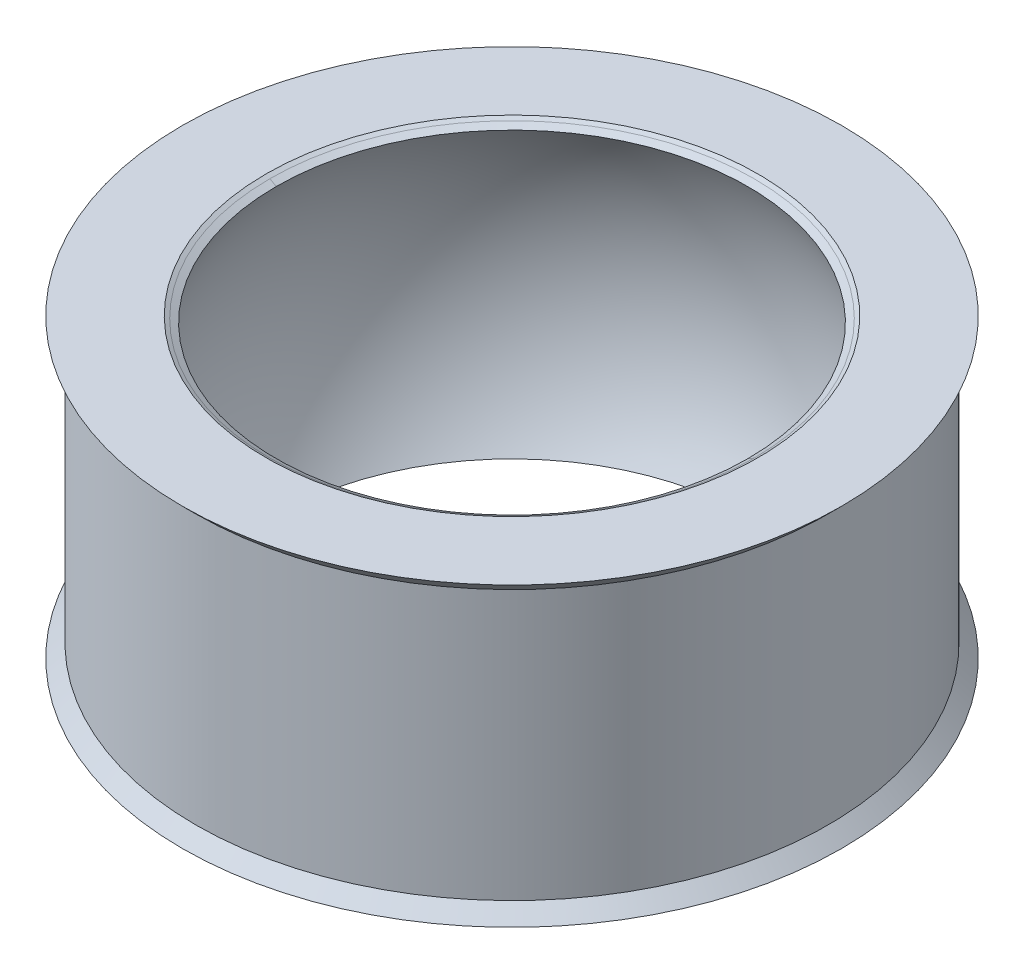
ISO-10303-21;
HEADER;
FILE_DESCRIPTION(('STEP AP214'),'2;1');
FILE_NAME('part.step','',(''),(''),'','','');
FILE_SCHEMA(('AUTOMOTIVE_DESIGN { 1 0 10303 214 1 1 1 1 }'));
ENDSEC;
DATA;
#1=APPLICATION_CONTEXT('core data for automotive mechanical design processes');
#2=APPLICATION_PROTOCOL_DEFINITION('international standard','automotive_design',2000,#1);
#3=PRODUCT_CONTEXT('',#1,'mechanical');
#4=PRODUCT('Part','Part','',(#3));
#5=PRODUCT_RELATED_PRODUCT_CATEGORY('part','',(#4));
#6=PRODUCT_DEFINITION_FORMATION('','',#4);
#7=PRODUCT_DEFINITION_CONTEXT('part definition',#1,'design');
#8=PRODUCT_DEFINITION('design','',#6,#7);
#9=PRODUCT_DEFINITION_SHAPE('','',#8);
#10=(LENGTH_UNIT() NAMED_UNIT(*) SI_UNIT(.MILLI.,.METRE.));
#11=(NAMED_UNIT(*) PLANE_ANGLE_UNIT() SI_UNIT($,.RADIAN.));
#12=(NAMED_UNIT(*) SI_UNIT($,.STERADIAN.) SOLID_ANGLE_UNIT());
#13=UNCERTAINTY_MEASURE_WITH_UNIT(LENGTH_MEASURE(1.E-05),#10,'distance_accuracy_value','');
#14=(GEOMETRIC_REPRESENTATION_CONTEXT(3) GLOBAL_UNCERTAINTY_ASSIGNED_CONTEXT((#13)) GLOBAL_UNIT_ASSIGNED_CONTEXT((#10,
#11,#12)) REPRESENTATION_CONTEXT('',''));
#15=CARTESIAN_POINT('',(0.,0.,0.));
#16=DIRECTION('',(0.,0.,1.));
#17=DIRECTION('',(1.,0.,0.));
#18=AXIS2_PLACEMENT_3D('',#15,#16,#17);
#19=CARTESIAN_POINT('',(0.00761999999999634,0.,61.9252));
#20=DIRECTION('',(0.,0.,-1.));
#21=DIRECTION('',(1.,0.,0.));
#22=AXIS2_PLACEMENT_3D('',#19,#20,#21);
#23=CIRCLE('',#22,10.3059784389139);
#24=TRIMMED_CURVE('',#23,(PARAMETER_VALUE(-1.57153570353039)),
(PARAMETER_VALUE(1.57153570353039)),.T.,.PARAMETER.);
#25=CARTESIAN_POINT('',(0.,0.,61.9252));
#26=DIRECTION('',(0.,-1.,0.));
#27=AXIS1_PLACEMENT('',#25,#26);
#28=SURFACE_OF_REVOLUTION('',#24,#27);
#29=CARTESIAN_POINT('',(0.,5.33089375278451,61.9252));
#30=DIRECTION('',(0.,1.,0.));
#31=DIRECTION('',(1.,0.,0.));
#32=AXIS2_PLACEMENT_3D('',#29,#30,#31);
#33=CIRCLE('',#32,8.82775397747082);
#34=CARTESIAN_POINT('',(8.82775397743589,5.33089375276572,61.9252));
#35=VERTEX_POINT('',#34);
#36=CARTESIAN_POINT('',(-8.82775397740902,5.33089375273474,61.9252));
#37=VERTEX_POINT('',#36);
#38=EDGE_CURVE('E65',#35,#37,#33,.T.);
#39=ORIENTED_EDGE('',*,*,#38,.T.);
#40=CARTESIAN_POINT('',(0.,5.33089375278451,61.9252));
#41=DIRECTION('',(0.,1.,0.));
#42=DIRECTION('',(1.,0.,0.));
#43=AXIS2_PLACEMENT_3D('',#40,#41,#42);
#44=CIRCLE('',#43,8.82775397747082);
#45=EDGE_CURVE('E63',#37,#35,#44,.T.);
#46=ORIENTED_EDGE('',*,*,#45,.T.);
#47=EDGE_LOOP('',(#39,#46));
#48=FACE_BOUND('',#47,.T.);
#49=CARTESIAN_POINT('',(0.,-5.3308937527845,61.9252));
#50=DIRECTION('',(0.,-1.,0.));
#51=DIRECTION('',(1.,0.,0.));
#52=AXIS2_PLACEMENT_3D('',#49,#50,#51);
#53=CIRCLE('',#52,8.82775397747082);
#54=CARTESIAN_POINT('',(8.82775397747082,-5.3308937527845,61.9252));
#55=VERTEX_POINT('',#54);
#56=EDGE_CURVE('E71',#55,#55,#53,.T.);
#57=ORIENTED_EDGE('',*,*,#56,.T.);
#58=EDGE_LOOP('',(#57));
#59=FACE_BOUND('',#58,.T.);
#60=ADVANCED_FACE('F15',(#48,#59),#28,.F.);
#61=CARTESIAN_POINT('',(0.,-5.46676973482363,61.9252));
#62=DIRECTION('',(0.,-1.,0.));
#63=DIRECTION('',(1.,0.,0.));
#64=AXIS2_PLACEMENT_3D('',#61,#62,#63);
#65=CONICAL_SURFACE('',#64,9.06319296990432,1.04737208404039);
#66=CARTESIAN_POINT('',(0.,-5.46676973488924,61.9252));
#67=DIRECTION('',(0.,-1.,0.));
#68=DIRECTION('',(0.,0.,1.));
#69=AXIS2_PLACEMENT_3D('',#66,#67,#68);
#70=CIRCLE('',#69,9.06319297001801);
#71=CARTESIAN_POINT('',(0.,-5.4667573076736,70.9884004721651));
#72=VERTEX_POINT('',#71);
#73=CARTESIAN_POINT('',(-9.06320047214609,-5.46675730766267,61.9252));
#74=VERTEX_POINT('',#73);
#75=EDGE_CURVE('E82',#72,#74,#70,.T.);
#76=ORIENTED_EDGE('',*,*,#75,.T.);
#77=CARTESIAN_POINT('',(0.,-5.46676973488924,61.9252));
#78=DIRECTION('',(0.,-1.,0.));
#79=DIRECTION('',(-1.,0.,0.));
#80=AXIS2_PLACEMENT_3D('',#77,#78,#79);
#81=CIRCLE('',#80,9.06319297001801);
#82=CARTESIAN_POINT('',(0.,-5.4667573076736,52.861999527835));
#83=VERTEX_POINT('',#82);
#84=EDGE_CURVE('E221',#74,#83,#81,.T.);
#85=ORIENTED_EDGE('',*,*,#84,.T.);
#86=CARTESIAN_POINT('',(0.,-5.46676973488924,61.9252));
#87=DIRECTION('',(0.,-1.,0.));
#88=DIRECTION('',(0.,0.,-1.));
#89=AXIS2_PLACEMENT_3D('',#86,#87,#88);
#90=CIRCLE('',#89,9.06319297001801);
#91=CARTESIAN_POINT('',(9.06320047214609,-5.46675730766267,61.9252));
#92=VERTEX_POINT('',#91);
#93=EDGE_CURVE('E218',#83,#92,#90,.T.);
#94=ORIENTED_EDGE('',*,*,#93,.T.);
#95=CARTESIAN_POINT('',(0.,-5.46676973488924,61.9252));
#96=DIRECTION('',(0.,-1.,0.));
#97=DIRECTION('',(1.,0.,0.));
#98=AXIS2_PLACEMENT_3D('',#95,#96,#97);
#99=CIRCLE('',#98,9.06319297001801);
#100=EDGE_CURVE('E176',#92,#72,#99,.T.);
#101=ORIENTED_EDGE('',*,*,#100,.T.);
#102=EDGE_LOOP('',(#76,#85,#94,#101));
#103=FACE_BOUND('',#102,.T.);
#104=ORIENTED_EDGE('',*,*,#56,.F.);
#105=EDGE_LOOP('',(#104));
#106=FACE_BOUND('',#105,.T.);
#107=ADVANCED_FACE('F191',(#103,#106),#65,.F.);
#108=CARTESIAN_POINT('',(0.,5.46676973482363,61.9252));
#109=DIRECTION('',(0.,1.,0.));
#110=DIRECTION('',(0.,0.,1.));
#111=AXIS2_PLACEMENT_3D('',#108,#109,#110);
#112=CONICAL_SURFACE('',#111,9.06319296984748,1.04737208404039);
#113=CARTESIAN_POINT('',(0.,5.46676973488924,61.9252));
#114=DIRECTION('',(0.,1.,0.));
#115=DIRECTION('',(1.,0.,0.));
#116=AXIS2_PLACEMENT_3D('',#113,#114,#115);
#117=CIRCLE('',#116,9.06319296996116);
#118=CARTESIAN_POINT('',(9.0632004721082,5.46675730764919,61.9252));
#119=VERTEX_POINT('',#118);
#120=CARTESIAN_POINT('',(0.,5.46675730769001,52.861999527835));
#121=VERTEX_POINT('',#120);
#122=EDGE_CURVE('E106',#119,#121,#117,.T.);
#123=ORIENTED_EDGE('',*,*,#122,.T.);
#124=CARTESIAN_POINT('',(0.,5.46676973495485,61.9252));
#125=DIRECTION('',(0.,1.,0.));
#126=DIRECTION('',(0.,0.,-1.));
#127=AXIS2_PLACEMENT_3D('',#124,#125,#126);
#128=CIRCLE('',#127,9.06319297007485);
#129=CARTESIAN_POINT('',(-9.06320047212714,5.46675730765065,61.9252));
#130=VERTEX_POINT('',#129);
#131=EDGE_CURVE('E76',#121,#130,#128,.T.);
#132=ORIENTED_EDGE('',*,*,#131,.T.);
#133=DIRECTION('',(0.866112657056274,-0.499848842438313,0.));
#134=VECTOR('',#133,1.);
#135=CARTESIAN_POINT('',(-499000.,287981.909693369,61.9252000007968));
#136=LINE('',#135,#134);
#137=EDGE_CURVE('E70',#130,#37,#136,.T.);
#138=ORIENTED_EDGE('',*,*,#137,.T.);
#139=ORIENTED_EDGE('',*,*,#38,.F.);
#140=DIRECTION('',(-0.866112657056274,-0.499848842438312,0.));
#141=VECTOR('',#140,1.);
#142=CARTESIAN_POINT('',(499000.,287981.909693369,61.9251999992479));
#143=LINE('',#142,#141);
#144=EDGE_CURVE('E80',#35,#119,#143,.F.);
#145=ORIENTED_EDGE('',*,*,#144,.T.);
#146=EDGE_LOOP('',(#123,#132,#138,#139,#145));
#147=FACE_BOUND('',#146,.T.);
#148=ADVANCED_FACE('F74',(#147),#112,.F.);
#149=CARTESIAN_POINT('',(0.,5.46676973476679,61.9252));
#150=DIRECTION('',(0.,1.,0.));
#151=DIRECTION('',(0.,0.,1.));
#152=AXIS2_PLACEMENT_3D('',#149,#150,#151);
#153=CONICAL_SURFACE('',#152,9.06319296979063,1.04737208411698);
#154=ORIENTED_EDGE('',*,*,#45,.F.);
#155=ORIENTED_EDGE('',*,*,#137,.F.);
#156=CARTESIAN_POINT('',(0.,5.4667697348652,61.9252));
#157=DIRECTION('',(0.,1.,0.));
#158=DIRECTION('',(-1.,0.,0.));
#159=AXIS2_PLACEMENT_3D('',#156,#157,#158);
#160=CIRCLE('',#159,9.06319296996117);
#161=CARTESIAN_POINT('',(0.,5.46675730766159,70.9884004721366));
#162=VERTEX_POINT('',#161);
#163=EDGE_CURVE('E36',#130,#162,#160,.T.);
#164=ORIENTED_EDGE('',*,*,#163,.T.);
#165=CARTESIAN_POINT('',(0.,5.4667697348652,61.9252));
#166=DIRECTION('',(0.,1.,0.));
#167=DIRECTION('',(0.,0.,1.));
#168=AXIS2_PLACEMENT_3D('',#165,#166,#167);
#169=CIRCLE('',#168,9.06319296996116);
#170=EDGE_CURVE('E222',#162,#119,#169,.T.);
#171=ORIENTED_EDGE('',*,*,#170,.T.);
#172=ORIENTED_EDGE('',*,*,#144,.F.);
#173=EDGE_LOOP('',(#154,#155,#164,#171,#172));
#174=FACE_BOUND('',#173,.T.);
#175=ADVANCED_FACE('F79',(#174),#153,.F.);
#176=CARTESIAN_POINT('',(0.,-5.5499,61.9252));
#177=DIRECTION('',(0.,-1.,0.));
#178=DIRECTION('',(1.,0.,0.));
#179=AXIS2_PLACEMENT_3D('',#176,#177,#178);
#180=CONICAL_SURFACE('',#179,9.20723686626833,1.0471975511966);
#181=CARTESIAN_POINT('',(0.,-5.5499,61.9252));
#182=DIRECTION('',(0.,-1.,0.));
#183=DIRECTION('',(1.,0.,0.));
#184=AXIS2_PLACEMENT_3D('',#181,#182,#183);
#185=CIRCLE('',#184,9.20723686626833);
#186=CARTESIAN_POINT('',(9.20723686626833,-5.5499,61.9252));
#187=VERTEX_POINT('',#186);
#188=EDGE_CURVE('E100',#187,#187,#185,.F.);
#189=ORIENTED_EDGE('',*,*,#188,.F.);
#190=EDGE_LOOP('',(#189));
#191=FACE_BOUND('',#190,.T.);
#192=ORIENTED_EDGE('',*,*,#75,.F.);
#193=ORIENTED_EDGE('',*,*,#100,.F.);
#194=ORIENTED_EDGE('',*,*,#93,.F.);
#195=ORIENTED_EDGE('',*,*,#84,.F.);
#196=EDGE_LOOP('',(#192,#193,#194,#195));
#197=FACE_BOUND('',#196,.T.);
#198=ADVANCED_FACE('F123',(#191,#197),#180,.F.);
#199=CARTESIAN_POINT('',(0.,5.5499,61.9252));
#200=DIRECTION('',(0.,1.,0.));
#201=DIRECTION('',(-1.,0.,0.));
#202=AXIS2_PLACEMENT_3D('',#199,#200,#201);
#203=CONICAL_SURFACE('',#202,9.20723686626833,1.04719755119659);
#204=CARTESIAN_POINT('',(0.,5.5499,61.9252));
#205=DIRECTION('',(0.,1.,0.));
#206=DIRECTION('',(-1.,0.,0.));
#207=AXIS2_PLACEMENT_3D('',#204,#205,#206);
#208=CIRCLE('',#207,9.20723686626833);
#209=CARTESIAN_POINT('',(-9.20723686626833,5.5499,61.9252));
#210=VERTEX_POINT('',#209);
#211=EDGE_CURVE('E97',#210,#210,#208,.F.);
#212=ORIENTED_EDGE('',*,*,#211,.F.);
#213=EDGE_LOOP('',(#212));
#214=FACE_BOUND('',#213,.T.);
#215=ORIENTED_EDGE('',*,*,#170,.F.);
#216=ORIENTED_EDGE('',*,*,#163,.F.);
#217=ORIENTED_EDGE('',*,*,#131,.F.);
#218=ORIENTED_EDGE('',*,*,#122,.F.);
#219=EDGE_LOOP('',(#215,#216,#217,#218));
#220=FACE_BOUND('',#219,.T.);
#221=ADVANCED_FACE('F112',(#214,#220),#203,.F.);
#222=CARTESIAN_POINT('',(0.,-5.5499,61.9252));
#223=DIRECTION('',(0.,-1.,0.));
#224=DIRECTION('',(0.,0.,-1.));
#225=AXIS2_PLACEMENT_3D('',#222,#223,#224);
#226=PLANE('',#225);
#227=ORIENTED_EDGE('',*,*,#188,.T.);
#228=EDGE_LOOP('',(#227));
#229=FACE_BOUND('',#228,.T.);
#230=CARTESIAN_POINT('',(0.,-5.5499,61.9252));
#231=DIRECTION('',(0.,-1.,0.));
#232=DIRECTION('',(0.,0.,-1.));
#233=AXIS2_PLACEMENT_3D('',#230,#231,#232);
#234=CIRCLE('',#233,12.3444);
#235=CARTESIAN_POINT('',(0.,-5.5499,49.5808));
#236=VERTEX_POINT('',#235);
#237=EDGE_CURVE('E94',#236,#236,#234,.F.);
#238=ORIENTED_EDGE('',*,*,#237,.F.);
#239=EDGE_LOOP('',(#238));
#240=FACE_BOUND('',#239,.T.);
#241=ADVANCED_FACE('F122',(#229,#240),#226,.T.);
#242=CARTESIAN_POINT('',(0.,5.5499,61.9252));
#243=DIRECTION('',(0.,1.,0.));
#244=DIRECTION('',(0.,0.,1.));
#245=AXIS2_PLACEMENT_3D('',#242,#243,#244);
#246=PLANE('',#245);
#247=ORIENTED_EDGE('',*,*,#211,.T.);
#248=EDGE_LOOP('',(#247));
#249=FACE_BOUND('',#248,.T.);
#250=CARTESIAN_POINT('',(0.,5.5499,61.9252));
#251=DIRECTION('',(0.,1.,0.));
#252=DIRECTION('',(0.,0.,1.));
#253=AXIS2_PLACEMENT_3D('',#250,#251,#252);
#254=CIRCLE('',#253,12.3444);
#255=CARTESIAN_POINT('',(0.,5.5499,74.2696));
#256=VERTEX_POINT('',#255);
#257=EDGE_CURVE('E91',#256,#256,#254,.F.);
#258=ORIENTED_EDGE('',*,*,#257,.F.);
#259=EDGE_LOOP('',(#258));
#260=FACE_BOUND('',#259,.T.);
#261=ADVANCED_FACE('F271',(#249,#260),#246,.T.);
#262=CARTESIAN_POINT('',(0.,-5.5499,61.9252));
#263=DIRECTION('',(0.,-1.,0.));
#264=DIRECTION('',(0.,0.,-1.));
#265=AXIS2_PLACEMENT_3D('',#262,#263,#264);
#266=CONICAL_SURFACE('',#265,12.3444,0.785398163397447);
#267=CARTESIAN_POINT('',(0.,-5.0419,61.9252));
#268=DIRECTION('',(0.,1.,0.));
#269=DIRECTION('',(0.,0.,1.));
#270=AXIS2_PLACEMENT_3D('',#267,#268,#269);
#271=CIRCLE('',#270,11.8364);
#272=CARTESIAN_POINT('',(0.,-5.0419,73.7616));
#273=VERTEX_POINT('',#272);
#274=EDGE_CURVE('E27',#273,#273,#271,.T.);
#275=ORIENTED_EDGE('',*,*,#274,.F.);
#276=EDGE_LOOP('',(#275));
#277=FACE_BOUND('',#276,.T.);
#278=ORIENTED_EDGE('',*,*,#237,.T.);
#279=EDGE_LOOP('',(#278));
#280=FACE_BOUND('',#279,.T.);
#281=ADVANCED_FACE('F259',(#277,#280),#266,.T.);
#282=CARTESIAN_POINT('',(0.,5.5499,61.9252));
#283=DIRECTION('',(0.,1.,0.));
#284=DIRECTION('',(0.,0.,1.));
#285=AXIS2_PLACEMENT_3D('',#282,#283,#284);
#286=CONICAL_SURFACE('',#285,12.3444,0.785398163397449);
#287=ORIENTED_EDGE('',*,*,#257,.T.);
#288=EDGE_LOOP('',(#287));
#289=FACE_BOUND('',#288,.T.);
#290=CARTESIAN_POINT('',(0.,5.0419,61.9252));
#291=DIRECTION('',(0.,1.,0.));
#292=DIRECTION('',(0.,0.,1.));
#293=AXIS2_PLACEMENT_3D('',#290,#291,#292);
#294=CIRCLE('',#293,11.8364);
#295=CARTESIAN_POINT('',(0.,5.0419,73.7616));
#296=VERTEX_POINT('',#295);
#297=EDGE_CURVE('E10',#296,#296,#294,.F.);
#298=ORIENTED_EDGE('',*,*,#297,.F.);
#299=EDGE_LOOP('',(#298));
#300=FACE_BOUND('',#299,.T.);
#301=ADVANCED_FACE('F254',(#289,#300),#286,.T.);
#302=CARTESIAN_POINT('',(0.,0.,61.9252));
#303=DIRECTION('',(0.,1.,0.));
#304=DIRECTION('',(0.,0.,1.));
#305=AXIS2_PLACEMENT_3D('',#302,#303,#304);
#306=CYLINDRICAL_SURFACE('',#305,11.8364);
#307=ORIENTED_EDGE('',*,*,#274,.T.);
#308=EDGE_LOOP('',(#307));
#309=FACE_BOUND('',#308,.T.);
#310=ORIENTED_EDGE('',*,*,#297,.T.);
#311=EDGE_LOOP('',(#310));
#312=FACE_BOUND('',#311,.T.);
#313=ADVANCED_FACE('F17',(#309,#312),#306,.T.);
#314=CLOSED_SHELL('',(#60,#107,#148,#175,#198,#221,#241,#261,#281,#301,#313));
#315=MANIFOLD_SOLID_BREP('B1',#314);
#316=ADVANCED_BREP_SHAPE_REPRESENTATION('',(#18,#315),#14);
#317=SHAPE_DEFINITION_REPRESENTATION(#9,#316);
ENDSEC;
END-ISO-10303-21;
